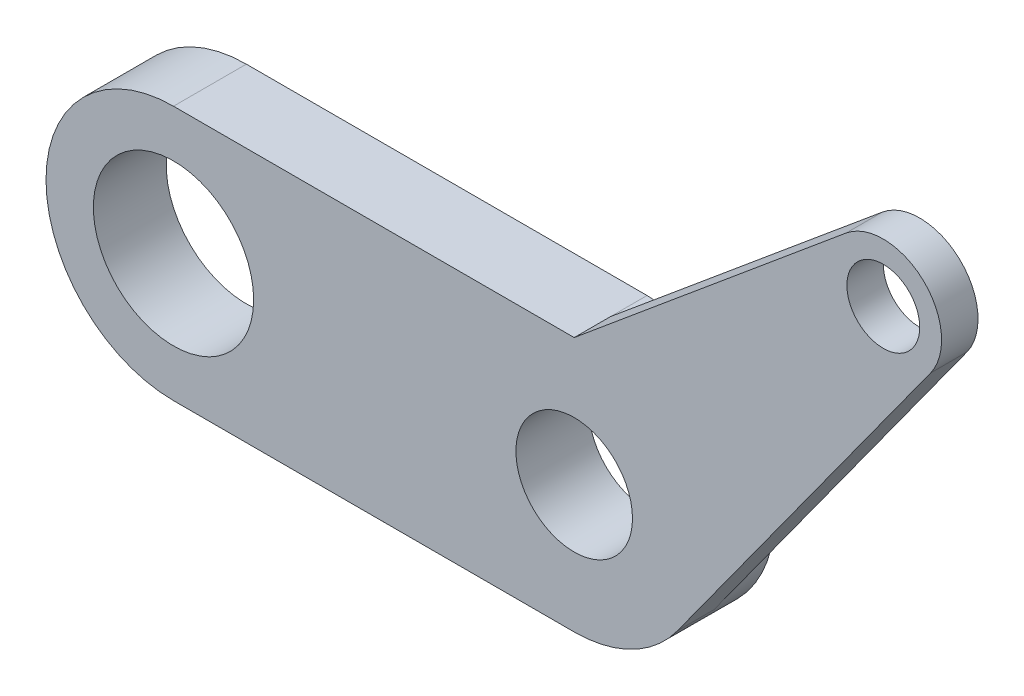
ISO-10303-21;
HEADER;
FILE_DESCRIPTION(('STEP AP214'),'2;1');
FILE_NAME('part.step','',(''),(''),'','','');
FILE_SCHEMA(('AUTOMOTIVE_DESIGN { 1 0 10303 214 1 1 1 1 }'));
ENDSEC;
DATA;
#1=APPLICATION_CONTEXT('core data for automotive mechanical design processes');
#2=APPLICATION_PROTOCOL_DEFINITION('international standard','automotive_design',2000,#1);
#3=PRODUCT_CONTEXT('',#1,'mechanical');
#4=PRODUCT('Part','Part','',(#3));
#5=PRODUCT_RELATED_PRODUCT_CATEGORY('part','',(#4));
#6=PRODUCT_DEFINITION_FORMATION('','',#4);
#7=PRODUCT_DEFINITION_CONTEXT('part definition',#1,'design');
#8=PRODUCT_DEFINITION('design','',#6,#7);
#9=PRODUCT_DEFINITION_SHAPE('','',#8);
#10=(LENGTH_UNIT() NAMED_UNIT(*) SI_UNIT(.MILLI.,.METRE.));
#11=(NAMED_UNIT(*) PLANE_ANGLE_UNIT() SI_UNIT($,.RADIAN.));
#12=(NAMED_UNIT(*) SI_UNIT($,.STERADIAN.) SOLID_ANGLE_UNIT());
#13=UNCERTAINTY_MEASURE_WITH_UNIT(LENGTH_MEASURE(1.E-05),#10,'distance_accuracy_value','');
#14=(GEOMETRIC_REPRESENTATION_CONTEXT(3) GLOBAL_UNCERTAINTY_ASSIGNED_CONTEXT((#13)) GLOBAL_UNIT_ASSIGNED_CONTEXT((#10,
#11,#12)) REPRESENTATION_CONTEXT('',''));
#15=CARTESIAN_POINT('',(0.,0.,0.));
#16=DIRECTION('',(0.,0.,1.));
#17=DIRECTION('',(1.,0.,0.));
#18=AXIS2_PLACEMENT_3D('',#15,#16,#17);
#19=CARTESIAN_POINT('',(27.5,0.,10.));
#20=DIRECTION('',(0.,0.,-1.));
#21=DIRECTION('',(-1.,0.,0.));
#22=AXIS2_PLACEMENT_3D('',#19,#20,#21);
#23=CYLINDRICAL_SURFACE('',#22,17.5);
#24=DIRECTION('',(0.,0.,1.));
#25=VECTOR('',#24,1.);
#26=CARTESIAN_POINT('',(41.6775499308407,-10.2589998517653,5.));
#27=LINE('',#26,#25);
#28=CARTESIAN_POINT('',(41.6775499308407,-10.2589998517653,5.));
#29=VERTEX_POINT('',#28);
#30=CARTESIAN_POINT('',(41.6775499308407,-10.2589998517653,10.));
#31=VERTEX_POINT('',#30);
#32=EDGE_CURVE('E143',#29,#31,#27,.T.);
#33=ORIENTED_EDGE('',*,*,#32,.T.);
#34=CARTESIAN_POINT('',(27.5,0.,10.));
#35=DIRECTION('',(0.,0.,1.));
#36=DIRECTION('',(1.,0.,0.));
#37=AXIS2_PLACEMENT_3D('',#34,#35,#36);
#38=CIRCLE('',#37,17.5);
#39=CARTESIAN_POINT('',(27.5,-17.5,10.));
#40=VERTEX_POINT('',#39);
#41=EDGE_CURVE('E178',#40,#31,#38,.T.);
#42=ORIENTED_EDGE('',*,*,#41,.F.);
#43=DIRECTION('',(0.,0.,-1.));
#44=VECTOR('',#43,1.);
#45=CARTESIAN_POINT('',(27.5,-17.5,10.));
#46=LINE('',#45,#44);
#47=CARTESIAN_POINT('',(27.5,-17.5,0.));
#48=VERTEX_POINT('',#47);
#49=EDGE_CURVE('E59',#40,#48,#46,.T.);
#50=ORIENTED_EDGE('',*,*,#49,.T.);
#51=CARTESIAN_POINT('',(27.5,0.,0.));
#52=DIRECTION('',(0.,0.,1.));
#53=DIRECTION('',(1.,0.,0.));
#54=AXIS2_PLACEMENT_3D('',#51,#52,#53);
#55=CIRCLE('',#54,17.5);
#56=CARTESIAN_POINT('',(27.5,17.5,0.));
#57=VERTEX_POINT('',#56);
#58=EDGE_CURVE('E187',#48,#57,#55,.T.);
#59=ORIENTED_EDGE('',*,*,#58,.T.);
#60=DIRECTION('',(0.,0.,-1.));
#61=VECTOR('',#60,1.);
#62=CARTESIAN_POINT('',(27.5,17.5,10.));
#63=LINE('',#62,#61);
#64=CARTESIAN_POINT('',(27.5,17.5,5.));
#65=VERTEX_POINT('',#64);
#66=EDGE_CURVE('E192',#65,#57,#63,.T.);
#67=ORIENTED_EDGE('',*,*,#66,.F.);
#68=CARTESIAN_POINT('',(27.5,0.,5.));
#69=DIRECTION('',(0.,0.,1.));
#70=DIRECTION('',(1.,0.,0.));
#71=AXIS2_PLACEMENT_3D('',#68,#69,#70);
#72=CIRCLE('',#71,17.5);
#73=EDGE_CURVE('E151',#29,#65,#72,.T.);
#74=ORIENTED_EDGE('',*,*,#73,.F.);
#75=EDGE_LOOP('',(#33,#42,#50,#59,#67,#74));
#76=FACE_BOUND('',#75,.T.);
#77=ADVANCED_FACE('F51',(#76),#23,.T.);
#78=CARTESIAN_POINT('',(-27.5,0.,10.));
#79=DIRECTION('',(0.,0.,1.));
#80=DIRECTION('',(1.,0.,0.));
#81=AXIS2_PLACEMENT_3D('',#78,#79,#80);
#82=PLANE('',#81);
#83=CARTESIAN_POINT('',(-27.5,0.,10.));
#84=DIRECTION('',(0.,0.,1.));
#85=DIRECTION('',(1.,0.,0.));
#86=AXIS2_PLACEMENT_3D('',#83,#84,#85);
#87=CIRCLE('',#86,11.);
#88=CARTESIAN_POINT('',(-16.5,0.,10.));
#89=VERTEX_POINT('',#88);
#90=EDGE_CURVE('E169',#89,#89,#87,.T.);
#91=ORIENTED_EDGE('',*,*,#90,.F.);
#92=EDGE_LOOP('',(#91));
#93=FACE_BOUND('',#92,.T.);
#94=CARTESIAN_POINT('',(-27.5,0.,10.));
#95=DIRECTION('',(0.,0.,1.));
#96=DIRECTION('',(1.,0.,0.));
#97=AXIS2_PLACEMENT_3D('',#94,#95,#96);
#98=CIRCLE('',#97,17.5);
#99=CARTESIAN_POINT('',(-27.5,17.5,10.));
#100=VERTEX_POINT('',#99);
#101=CARTESIAN_POINT('',(-27.5,-17.5,10.));
#102=VERTEX_POINT('',#101);
#103=EDGE_CURVE('E175',#100,#102,#98,.T.);
#104=ORIENTED_EDGE('',*,*,#103,.T.);
#105=DIRECTION('',(1.,0.,0.));
#106=VECTOR('',#105,1.);
#107=CARTESIAN_POINT('',(-27.5,-17.5,10.));
#108=LINE('',#107,#106);
#109=EDGE_CURVE('E100',#102,#40,#108,.T.);
#110=ORIENTED_EDGE('',*,*,#109,.T.);
#111=ORIENTED_EDGE('',*,*,#41,.T.);
#112=DIRECTION('',(0.586228562958015,0.810145710333753,0.));
#113=VECTOR('',#112,1.);
#114=CARTESIAN_POINT('',(32.2267919100756,-23.3195901295431,10.));
#115=LINE('',#114,#113);
#116=CARTESIAN_POINT('',(76.4075725538629,37.7365783675287,10.));
#117=VERTEX_POINT('',#116);
#118=EDGE_CURVE('E155',#31,#117,#115,.T.);
#119=ORIENTED_EDGE('',*,*,#118,.T.);
#120=CARTESIAN_POINT('',(69.9264068711929,42.4264068711928,10.));
#121=DIRECTION('',(0.,0.,1.));
#122=DIRECTION('',(1.,0.,0.));
#123=AXIS2_PLACEMENT_3D('',#120,#121,#122);
#124=CIRCLE('',#123,8.00000000000001);
#125=CARTESIAN_POINT('',(64.8064163411667,48.5734140269103,10.));
#126=VERTEX_POINT('',#125);
#127=EDGE_CURVE('E127',#117,#126,#124,.T.);
#128=ORIENTED_EDGE('',*,*,#127,.T.);
#129=DIRECTION('',(0.768375894464684,0.639998816253278,0.));
#130=VECTOR('',#129,1.);
#131=CARTESIAN_POINT('',(2.65816423149225,-3.19136421370909,10.));
#132=LINE('',#131,#130);
#133=CARTESIAN_POINT('',(27.5,17.5,10.));
#134=VERTEX_POINT('',#133);
#135=EDGE_CURVE('E147',#134,#126,#132,.T.);
#136=ORIENTED_EDGE('',*,*,#135,.F.);
#137=DIRECTION('',(-1.,0.,0.));
#138=VECTOR('',#137,1.);
#139=CARTESIAN_POINT('',(-27.5,17.5,10.));
#140=LINE('',#139,#138);
#141=EDGE_CURVE('E75',#134,#100,#140,.T.);
#142=ORIENTED_EDGE('',*,*,#141,.T.);
#143=EDGE_LOOP('',(#104,#110,#111,#119,#128,#136,#142));
#144=FACE_BOUND('',#143,.T.);
#145=CARTESIAN_POINT('',(27.5,0.,10.));
#146=DIRECTION('',(0.,0.,1.));
#147=DIRECTION('',(1.,0.,0.));
#148=AXIS2_PLACEMENT_3D('',#145,#146,#147);
#149=CIRCLE('',#148,7.99999999999999);
#150=CARTESIAN_POINT('',(35.5,0.,10.));
#151=VERTEX_POINT('',#150);
#152=EDGE_CURVE('E163',#151,#151,#149,.T.);
#153=ORIENTED_EDGE('',*,*,#152,.F.);
#154=EDGE_LOOP('',(#153));
#155=FACE_BOUND('',#154,.T.);
#156=CARTESIAN_POINT('',(69.9264068711929,42.4264068711928,10.));
#157=DIRECTION('',(0.,0.,1.));
#158=DIRECTION('',(1.,0.,0.));
#159=AXIS2_PLACEMENT_3D('',#156,#157,#158);
#160=CIRCLE('',#159,5.00000000000001);
#161=CARTESIAN_POINT('',(74.9264068711929,42.4264068711928,10.));
#162=VERTEX_POINT('',#161);
#163=EDGE_CURVE('E144',#162,#162,#160,.T.);
#164=ORIENTED_EDGE('',*,*,#163,.F.);
#165=EDGE_LOOP('',(#164));
#166=FACE_BOUND('',#165,.T.);
#167=ADVANCED_FACE('F209',(#93,#144,#155,#166),#82,.T.);
#168=CARTESIAN_POINT('',(-27.5,0.,0.));
#169=DIRECTION('',(0.,0.,1.));
#170=DIRECTION('',(1.,0.,0.));
#171=AXIS2_PLACEMENT_3D('',#168,#169,#170);
#172=PLANE('',#171);
#173=CARTESIAN_POINT('',(-27.5,0.,0.));
#174=DIRECTION('',(0.,0.,1.));
#175=DIRECTION('',(1.,0.,0.));
#176=AXIS2_PLACEMENT_3D('',#173,#174,#175);
#177=CIRCLE('',#176,11.);
#178=CARTESIAN_POINT('',(-16.5,0.,0.));
#179=VERTEX_POINT('',#178);
#180=EDGE_CURVE('E166',#179,#179,#177,.T.);
#181=ORIENTED_EDGE('',*,*,#180,.T.);
#182=EDGE_LOOP('',(#181));
#183=FACE_BOUND('',#182,.T.);
#184=CARTESIAN_POINT('',(-27.5,0.,0.));
#185=DIRECTION('',(0.,0.,1.));
#186=DIRECTION('',(1.,0.,0.));
#187=AXIS2_PLACEMENT_3D('',#184,#185,#186);
#188=CIRCLE('',#187,17.5);
#189=CARTESIAN_POINT('',(-27.5,17.5,0.));
#190=VERTEX_POINT('',#189);
#191=CARTESIAN_POINT('',(-27.5,-17.5,0.));
#192=VERTEX_POINT('',#191);
#193=EDGE_CURVE('E172',#190,#192,#188,.T.);
#194=ORIENTED_EDGE('',*,*,#193,.F.);
#195=DIRECTION('',(-1.,0.,0.));
#196=VECTOR('',#195,1.);
#197=CARTESIAN_POINT('',(-27.5,17.5,0.));
#198=LINE('',#197,#196);
#199=EDGE_CURVE('E95',#57,#190,#198,.T.);
#200=ORIENTED_EDGE('',*,*,#199,.F.);
#201=ORIENTED_EDGE('',*,*,#58,.F.);
#202=DIRECTION('',(1.,0.,0.));
#203=VECTOR('',#202,1.);
#204=CARTESIAN_POINT('',(-27.5,-17.5,0.));
#205=LINE('',#204,#203);
#206=EDGE_CURVE('E185',#192,#48,#205,.T.);
#207=ORIENTED_EDGE('',*,*,#206,.F.);
#208=EDGE_LOOP('',(#194,#200,#201,#207));
#209=FACE_BOUND('',#208,.T.);
#210=CARTESIAN_POINT('',(27.5,0.,0.));
#211=DIRECTION('',(0.,0.,1.));
#212=DIRECTION('',(1.,0.,0.));
#213=AXIS2_PLACEMENT_3D('',#210,#211,#212);
#214=CIRCLE('',#213,7.99999999999999);
#215=CARTESIAN_POINT('',(35.5,0.,0.));
#216=VERTEX_POINT('',#215);
#217=EDGE_CURVE('E161',#216,#216,#214,.T.);
#218=ORIENTED_EDGE('',*,*,#217,.T.);
#219=EDGE_LOOP('',(#218));
#220=FACE_BOUND('',#219,.T.);
#221=ADVANCED_FACE('F202',(#183,#209,#220),#172,.F.);
#222=CARTESIAN_POINT('',(-27.5,0.,10.));
#223=DIRECTION('',(0.,0.,-1.));
#224=DIRECTION('',(-1.,0.,0.));
#225=AXIS2_PLACEMENT_3D('',#222,#223,#224);
#226=CYLINDRICAL_SURFACE('',#225,17.5);
#227=ORIENTED_EDGE('',*,*,#193,.T.);
#228=DIRECTION('',(0.,0.,-1.));
#229=VECTOR('',#228,1.);
#230=CARTESIAN_POINT('',(-27.5,-17.5,10.));
#231=LINE('',#230,#229);
#232=EDGE_CURVE('E13',#102,#192,#231,.T.);
#233=ORIENTED_EDGE('',*,*,#232,.F.);
#234=ORIENTED_EDGE('',*,*,#103,.F.);
#235=DIRECTION('',(0.,0.,-1.));
#236=VECTOR('',#235,1.);
#237=CARTESIAN_POINT('',(-27.5,17.5,10.));
#238=LINE('',#237,#236);
#239=EDGE_CURVE('E182',#100,#190,#238,.T.);
#240=ORIENTED_EDGE('',*,*,#239,.T.);
#241=EDGE_LOOP('',(#227,#233,#234,#240));
#242=FACE_BOUND('',#241,.T.);
#243=ADVANCED_FACE('F53',(#242),#226,.T.);
#244=CARTESIAN_POINT('',(-27.5,-17.5,10.));
#245=DIRECTION('',(0.,1.,0.));
#246=DIRECTION('',(-1.,0.,0.));
#247=AXIS2_PLACEMENT_3D('',#244,#245,#246);
#248=PLANE('',#247);
#249=ORIENTED_EDGE('',*,*,#206,.T.);
#250=ORIENTED_EDGE('',*,*,#49,.F.);
#251=ORIENTED_EDGE('',*,*,#109,.F.);
#252=ORIENTED_EDGE('',*,*,#232,.T.);
#253=EDGE_LOOP('',(#249,#250,#251,#252));
#254=FACE_BOUND('',#253,.T.);
#255=ADVANCED_FACE('F236',(#254),#248,.F.);
#256=CARTESIAN_POINT('',(-27.5,17.5,10.));
#257=DIRECTION('',(0.,-1.,0.));
#258=DIRECTION('',(1.,0.,0.));
#259=AXIS2_PLACEMENT_3D('',#256,#257,#258);
#260=PLANE('',#259);
#261=ORIENTED_EDGE('',*,*,#199,.T.);
#262=ORIENTED_EDGE('',*,*,#239,.F.);
#263=ORIENTED_EDGE('',*,*,#141,.F.);
#264=EDGE_CURVE('E193',#134,#65,#63,.T.);
#265=ORIENTED_EDGE('',*,*,#264,.T.);
#266=ORIENTED_EDGE('',*,*,#66,.T.);
#267=EDGE_LOOP('',(#261,#262,#263,#265,#266));
#268=FACE_BOUND('',#267,.T.);
#269=ADVANCED_FACE('F207',(#268),#260,.F.);
#270=CARTESIAN_POINT('',(-27.5,0.,10.));
#271=DIRECTION('',(0.,0.,-1.));
#272=DIRECTION('',(-1.,0.,0.));
#273=AXIS2_PLACEMENT_3D('',#270,#271,#272);
#274=CYLINDRICAL_SURFACE('',#273,11.);
#275=ORIENTED_EDGE('',*,*,#90,.T.);
#276=EDGE_LOOP('',(#275));
#277=FACE_BOUND('',#276,.T.);
#278=ORIENTED_EDGE('',*,*,#180,.F.);
#279=EDGE_LOOP('',(#278));
#280=FACE_BOUND('',#279,.T.);
#281=ADVANCED_FACE('F242',(#277,#280),#274,.F.);
#282=CARTESIAN_POINT('',(27.5,0.,10.));
#283=DIRECTION('',(0.,0.,-1.));
#284=DIRECTION('',(-1.,0.,0.));
#285=AXIS2_PLACEMENT_3D('',#282,#283,#284);
#286=CYLINDRICAL_SURFACE('',#285,7.99999999999999);
#287=ORIENTED_EDGE('',*,*,#152,.T.);
#288=EDGE_LOOP('',(#287));
#289=FACE_BOUND('',#288,.T.);
#290=ORIENTED_EDGE('',*,*,#217,.F.);
#291=EDGE_LOOP('',(#290));
#292=FACE_BOUND('',#291,.T.);
#293=ADVANCED_FACE('F252',(#289,#292),#286,.F.);
#294=CARTESIAN_POINT('',(32.2267919100756,-23.3195901295431,5.));
#295=DIRECTION('',(0.810145710333753,-0.586228562958015,0.));
#296=DIRECTION('',(0.586228562958015,0.810145710333753,0.));
#297=AXIS2_PLACEMENT_3D('',#294,#295,#296);
#298=PLANE('',#297);
#299=ORIENTED_EDGE('',*,*,#118,.F.);
#300=ORIENTED_EDGE('',*,*,#32,.F.);
#301=DIRECTION('',(0.586228562958015,0.810145710333753,0.));
#302=VECTOR('',#301,1.);
#303=CARTESIAN_POINT('',(32.2267919100756,-23.3195901295431,5.));
#304=LINE('',#303,#302);
#305=CARTESIAN_POINT('',(76.4075725538629,37.7365783675287,5.));
#306=VERTEX_POINT('',#305);
#307=EDGE_CURVE('E138',#29,#306,#304,.T.);
#308=ORIENTED_EDGE('',*,*,#307,.T.);
#309=DIRECTION('',(0.,0.,1.));
#310=VECTOR('',#309,1.);
#311=CARTESIAN_POINT('',(76.4075725538629,37.7365783675287,5.));
#312=LINE('',#311,#310);
#313=EDGE_CURVE('E122',#306,#117,#312,.T.);
#314=ORIENTED_EDGE('',*,*,#313,.T.);
#315=EDGE_LOOP('',(#299,#300,#308,#314));
#316=FACE_BOUND('',#315,.T.);
#317=ADVANCED_FACE('F141',(#316),#298,.T.);
#318=CARTESIAN_POINT('',(2.65816423149225,-3.19136421370909,5.));
#319=DIRECTION('',(0.639998816253278,-0.768375894464684,0.));
#320=DIRECTION('',(0.768375894464684,0.639998816253278,0.));
#321=AXIS2_PLACEMENT_3D('',#318,#319,#320);
#322=PLANE('',#321);
#323=ORIENTED_EDGE('',*,*,#135,.T.);
#324=DIRECTION('',(0.,0.,1.));
#325=VECTOR('',#324,1.);
#326=CARTESIAN_POINT('',(64.8064163411667,48.5734140269103,5.));
#327=LINE('',#326,#325);
#328=CARTESIAN_POINT('',(64.8064163411667,48.5734140269103,5.));
#329=VERTEX_POINT('',#328);
#330=EDGE_CURVE('E131',#329,#126,#327,.T.);
#331=ORIENTED_EDGE('',*,*,#330,.F.);
#332=DIRECTION('',(0.768375894464684,0.639998816253278,0.));
#333=VECTOR('',#332,1.);
#334=CARTESIAN_POINT('',(2.65816423149225,-3.19136421370909,5.));
#335=LINE('',#334,#333);
#336=EDGE_CURVE('E66',#65,#329,#335,.T.);
#337=ORIENTED_EDGE('',*,*,#336,.F.);
#338=ORIENTED_EDGE('',*,*,#264,.F.);
#339=EDGE_LOOP('',(#323,#331,#337,#338));
#340=FACE_BOUND('',#339,.T.);
#341=ADVANCED_FACE('F208',(#340),#322,.F.);
#342=CARTESIAN_POINT('',(69.9264068711929,42.4264068711928,5.));
#343=DIRECTION('',(0.,0.,1.));
#344=DIRECTION('',(1.,0.,0.));
#345=AXIS2_PLACEMENT_3D('',#342,#343,#344);
#346=CYLINDRICAL_SURFACE('',#345,8.00000000000001);
#347=ORIENTED_EDGE('',*,*,#127,.F.);
#348=ORIENTED_EDGE('',*,*,#313,.F.);
#349=CARTESIAN_POINT('',(69.9264068711929,42.4264068711928,5.));
#350=DIRECTION('',(0.,0.,1.));
#351=DIRECTION('',(1.,0.,0.));
#352=AXIS2_PLACEMENT_3D('',#349,#350,#351);
#353=CIRCLE('',#352,8.00000000000001);
#354=EDGE_CURVE('E125',#306,#329,#353,.T.);
#355=ORIENTED_EDGE('',*,*,#354,.T.);
#356=ORIENTED_EDGE('',*,*,#330,.T.);
#357=EDGE_LOOP('',(#347,#348,#355,#356));
#358=FACE_BOUND('',#357,.T.);
#359=ADVANCED_FACE('F124',(#358),#346,.T.);
#360=CARTESIAN_POINT('',(69.9264068711929,42.4264068711928,5.));
#361=DIRECTION('',(0.,0.,1.));
#362=DIRECTION('',(1.,0.,0.));
#363=AXIS2_PLACEMENT_3D('',#360,#361,#362);
#364=CYLINDRICAL_SURFACE('',#363,5.00000000000001);
#365=CARTESIAN_POINT('',(69.9264068711929,42.4264068711928,5.));
#366=DIRECTION('',(0.,0.,1.));
#367=DIRECTION('',(1.,0.,0.));
#368=AXIS2_PLACEMENT_3D('',#365,#366,#367);
#369=CIRCLE('',#368,5.00000000000001);
#370=CARTESIAN_POINT('',(74.9264068711929,42.4264068711928,5.));
#371=VERTEX_POINT('',#370);
#372=EDGE_CURVE('E132',#371,#371,#369,.T.);
#373=ORIENTED_EDGE('',*,*,#372,.F.);
#374=EDGE_LOOP('',(#373));
#375=FACE_BOUND('',#374,.T.);
#376=ORIENTED_EDGE('',*,*,#163,.T.);
#377=EDGE_LOOP('',(#376));
#378=FACE_BOUND('',#377,.T.);
#379=ADVANCED_FACE('F218',(#375,#378),#364,.F.);
#380=CARTESIAN_POINT('',(0.,0.,5.));
#381=DIRECTION('',(0.,0.,1.));
#382=DIRECTION('',(1.,0.,0.));
#383=AXIS2_PLACEMENT_3D('',#380,#381,#382);
#384=PLANE('',#383);
#385=ORIENTED_EDGE('',*,*,#307,.F.);
#386=ORIENTED_EDGE('',*,*,#73,.T.);
#387=ORIENTED_EDGE('',*,*,#336,.T.);
#388=ORIENTED_EDGE('',*,*,#354,.F.);
#389=EDGE_LOOP('',(#385,#386,#387,#388));
#390=FACE_BOUND('',#389,.T.);
#391=ORIENTED_EDGE('',*,*,#372,.T.);
#392=EDGE_LOOP('',(#391));
#393=FACE_BOUND('',#392,.T.);
#394=ADVANCED_FACE('F136',(#390,#393),#384,.F.);
#395=CLOSED_SHELL('',(#77,#167,#221,#243,#255,#269,#281,#293,#317,#341,#359,#379,#394));
#396=MANIFOLD_SOLID_BREP('B2',#395);
#397=ADVANCED_BREP_SHAPE_REPRESENTATION('',(#18,#396),#14);
#398=SHAPE_DEFINITION_REPRESENTATION(#9,#397);
ENDSEC;
END-ISO-10303-21;
